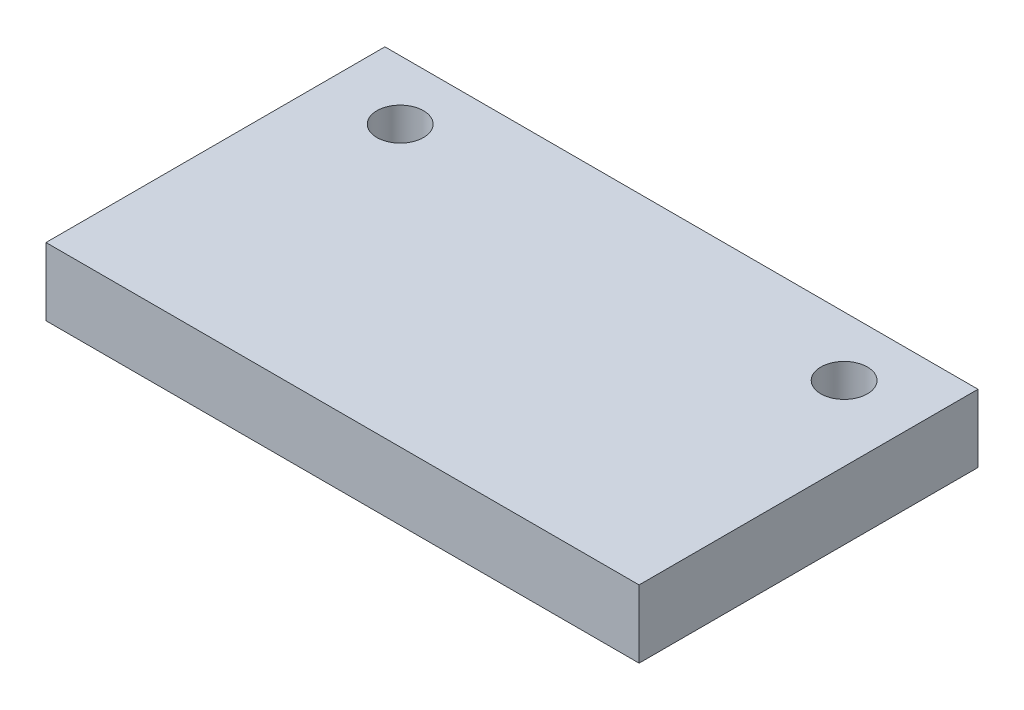
ISO-10303-21;
HEADER;
FILE_DESCRIPTION(('STEP AP214'),'2;1');
FILE_NAME('part.step','',(''),(''),'','','');
FILE_SCHEMA(('AUTOMOTIVE_DESIGN { 1 0 10303 214 1 1 1 1 }'));
ENDSEC;
DATA;
#1=APPLICATION_CONTEXT('core data for automotive mechanical design processes');
#2=APPLICATION_PROTOCOL_DEFINITION('international standard','automotive_design',2000,#1);
#3=PRODUCT_CONTEXT('',#1,'mechanical');
#4=PRODUCT('Part','Part','',(#3));
#5=PRODUCT_RELATED_PRODUCT_CATEGORY('part','',(#4));
#6=PRODUCT_DEFINITION_FORMATION('','',#4);
#7=PRODUCT_DEFINITION_CONTEXT('part definition',#1,'design');
#8=PRODUCT_DEFINITION('design','',#6,#7);
#9=PRODUCT_DEFINITION_SHAPE('','',#8);
#10=(LENGTH_UNIT() NAMED_UNIT(*) SI_UNIT(.MILLI.,.METRE.));
#11=(NAMED_UNIT(*) PLANE_ANGLE_UNIT() SI_UNIT($,.RADIAN.));
#12=(NAMED_UNIT(*) SI_UNIT($,.STERADIAN.) SOLID_ANGLE_UNIT());
#13=UNCERTAINTY_MEASURE_WITH_UNIT(LENGTH_MEASURE(1.E-05),#10,'distance_accuracy_value','');
#14=(GEOMETRIC_REPRESENTATION_CONTEXT(3) GLOBAL_UNCERTAINTY_ASSIGNED_CONTEXT((#13)) GLOBAL_UNIT_ASSIGNED_CONTEXT((#10,
#11,#12)) REPRESENTATION_CONTEXT('',''));
#15=CARTESIAN_POINT('',(0.,0.,0.));
#16=DIRECTION('',(0.,0.,1.));
#17=DIRECTION('',(1.,0.,0.));
#18=AXIS2_PLACEMENT_3D('',#15,#16,#17);
#19=CARTESIAN_POINT('',(0.,80.,0.));
#20=DIRECTION('',(0.,1.,0.));
#21=DIRECTION('',(0.,0.,1.));
#22=AXIS2_PLACEMENT_3D('',#19,#20,#21);
#23=PLANE('',#22);
#24=DIRECTION('',(0.,0.,1.));
#25=VECTOR('',#24,1.);
#26=CARTESIAN_POINT('',(-321.608040201005,80.,-142.462311557789));
#27=LINE('',#26,#25);
#28=CARTESIAN_POINT('',(-321.608040201005,80.,-142.462311557789));
#29=VERTEX_POINT('',#28);
#30=CARTESIAN_POINT('',(-321.608040201005,80.,257.537688442211));
#31=VERTEX_POINT('',#30);
#32=EDGE_CURVE('E87',#29,#31,#27,.T.);
#33=ORIENTED_EDGE('',*,*,#32,.T.);
#34=DIRECTION('',(1.,0.,0.));
#35=VECTOR('',#34,1.);
#36=CARTESIAN_POINT('',(-321.608040201005,80.,257.537688442211));
#37=LINE('',#36,#35);
#38=CARTESIAN_POINT('',(378.391959798995,80.,257.537688442211));
#39=VERTEX_POINT('',#38);
#40=EDGE_CURVE('E82',#31,#39,#37,.T.);
#41=ORIENTED_EDGE('',*,*,#40,.T.);
#42=DIRECTION('',(0.,0.,-1.));
#43=VECTOR('',#42,1.);
#44=CARTESIAN_POINT('',(378.391959798995,80.,-142.462311557789));
#45=LINE('',#44,#43);
#46=CARTESIAN_POINT('',(378.391959798995,80.,-142.462311557789));
#47=VERTEX_POINT('',#46);
#48=EDGE_CURVE('E85',#39,#47,#45,.T.);
#49=ORIENTED_EDGE('',*,*,#48,.T.);
#50=DIRECTION('',(-1.,0.,0.));
#51=VECTOR('',#50,1.);
#52=CARTESIAN_POINT('',(-321.608040201005,80.,-142.462311557789));
#53=LINE('',#52,#51);
#54=EDGE_CURVE('E52',#47,#29,#53,.T.);
#55=ORIENTED_EDGE('',*,*,#54,.T.);
#56=EDGE_LOOP('',(#33,#41,#49,#55));
#57=FACE_BOUND('',#56,.T.);
#58=CARTESIAN_POINT('',(-233.576451519509,80.,-72.4747749309411));
#59=DIRECTION('',(0.,1.,0.));
#60=DIRECTION('',(0.,0.,1.));
#61=AXIS2_PLACEMENT_3D('',#58,#59,#60);
#62=CIRCLE('',#61,27.5);
#63=CARTESIAN_POINT('',(-233.576451519509,80.,-44.9747749309411));
#64=VERTEX_POINT('',#63);
#65=EDGE_CURVE('E114',#64,#64,#62,.T.);
#66=ORIENTED_EDGE('',*,*,#65,.F.);
#67=EDGE_LOOP('',(#66));
#68=FACE_BOUND('',#67,.T.);
#69=CARTESIAN_POINT('',(290.3603711175,80.,-72.4747749309411));
#70=DIRECTION('',(0.,-1.,0.));
#71=DIRECTION('',(0.,0.,-1.));
#72=AXIS2_PLACEMENT_3D('',#69,#70,#71);
#73=CIRCLE('',#72,27.4999999999999);
#74=CARTESIAN_POINT('',(290.3603711175,80.,-99.9747749309411));
#75=VERTEX_POINT('',#74);
#76=EDGE_CURVE('E120',#75,#75,#73,.T.);
#77=ORIENTED_EDGE('',*,*,#76,.T.);
#78=EDGE_LOOP('',(#77));
#79=FACE_BOUND('',#78,.T.);
#80=ADVANCED_FACE('F35',(#57,#68,#79),#23,.T.);
#81=CARTESIAN_POINT('',(0.,0.,0.));
#82=DIRECTION('',(0.,1.,0.));
#83=DIRECTION('',(0.,0.,1.));
#84=AXIS2_PLACEMENT_3D('',#81,#82,#83);
#85=PLANE('',#84);
#86=DIRECTION('',(0.,0.,1.));
#87=VECTOR('',#86,1.);
#88=CARTESIAN_POINT('',(-321.608040201005,0.,-142.462311557789));
#89=LINE('',#88,#87);
#90=CARTESIAN_POINT('',(-321.608040201005,0.,-142.462311557789));
#91=VERTEX_POINT('',#90);
#92=CARTESIAN_POINT('',(-321.608040201005,0.,257.537688442211));
#93=VERTEX_POINT('',#92);
#94=EDGE_CURVE('E99',#91,#93,#89,.T.);
#95=ORIENTED_EDGE('',*,*,#94,.F.);
#96=DIRECTION('',(-1.,0.,0.));
#97=VECTOR('',#96,1.);
#98=CARTESIAN_POINT('',(-321.608040201005,0.,-142.462311557789));
#99=LINE('',#98,#97);
#100=CARTESIAN_POINT('',(378.391959798995,0.,-142.462311557789));
#101=VERTEX_POINT('',#100);
#102=EDGE_CURVE('E75',#101,#91,#99,.T.);
#103=ORIENTED_EDGE('',*,*,#102,.F.);
#104=DIRECTION('',(0.,0.,-1.));
#105=VECTOR('',#104,1.);
#106=CARTESIAN_POINT('',(378.391959798995,0.,-142.462311557789));
#107=LINE('',#106,#105);
#108=CARTESIAN_POINT('',(378.391959798995,0.,257.537688442211));
#109=VERTEX_POINT('',#108);
#110=EDGE_CURVE('E69',#109,#101,#107,.T.);
#111=ORIENTED_EDGE('',*,*,#110,.F.);
#112=DIRECTION('',(1.,0.,0.));
#113=VECTOR('',#112,1.);
#114=CARTESIAN_POINT('',(-321.608040201005,0.,257.537688442211));
#115=LINE('',#114,#113);
#116=EDGE_CURVE('E91',#93,#109,#115,.T.);
#117=ORIENTED_EDGE('',*,*,#116,.F.);
#118=EDGE_LOOP('',(#95,#103,#111,#117));
#119=FACE_BOUND('',#118,.T.);
#120=CARTESIAN_POINT('',(-233.576451519509,0.,-72.4747749309411));
#121=DIRECTION('',(0.,1.,0.));
#122=DIRECTION('',(0.,0.,1.));
#123=AXIS2_PLACEMENT_3D('',#120,#121,#122);
#124=CIRCLE('',#123,27.5);
#125=CARTESIAN_POINT('',(-233.576451519509,0.,-44.9747749309411));
#126=VERTEX_POINT('',#125);
#127=EDGE_CURVE('E102',#126,#126,#124,.T.);
#128=ORIENTED_EDGE('',*,*,#127,.T.);
#129=EDGE_LOOP('',(#128));
#130=FACE_BOUND('',#129,.T.);
#131=CARTESIAN_POINT('',(290.3603711175,0.,-72.4747749309411));
#132=DIRECTION('',(0.,-1.,0.));
#133=DIRECTION('',(0.,0.,-1.));
#134=AXIS2_PLACEMENT_3D('',#131,#132,#133);
#135=CIRCLE('',#134,27.4999999999999);
#136=CARTESIAN_POINT('',(290.3603711175,0.,-99.9747749309411));
#137=VERTEX_POINT('',#136);
#138=EDGE_CURVE('E117',#137,#137,#135,.T.);
#139=ORIENTED_EDGE('',*,*,#138,.F.);
#140=EDGE_LOOP('',(#139));
#141=FACE_BOUND('',#140,.T.);
#142=ADVANCED_FACE('F110',(#119,#130,#141),#85,.F.);
#143=CARTESIAN_POINT('',(-321.608040201005,80.,-142.462311557789));
#144=DIRECTION('',(1.,0.,0.));
#145=DIRECTION('',(0.,0.,-1.));
#146=AXIS2_PLACEMENT_3D('',#143,#144,#145);
#147=PLANE('',#146);
#148=ORIENTED_EDGE('',*,*,#94,.T.);
#149=DIRECTION('',(0.,-1.,0.));
#150=VECTOR('',#149,1.);
#151=CARTESIAN_POINT('',(-321.608040201005,80.,257.537688442211));
#152=LINE('',#151,#150);
#153=EDGE_CURVE('E11',#31,#93,#152,.T.);
#154=ORIENTED_EDGE('',*,*,#153,.F.);
#155=ORIENTED_EDGE('',*,*,#32,.F.);
#156=DIRECTION('',(0.,-1.,0.));
#157=VECTOR('',#156,1.);
#158=CARTESIAN_POINT('',(-321.608040201005,80.,-142.462311557789));
#159=LINE('',#158,#157);
#160=EDGE_CURVE('E95',#29,#91,#159,.T.);
#161=ORIENTED_EDGE('',*,*,#160,.T.);
#162=EDGE_LOOP('',(#148,#154,#155,#161));
#163=FACE_BOUND('',#162,.T.);
#164=ADVANCED_FACE('F37',(#163),#147,.F.);
#165=CARTESIAN_POINT('',(-321.608040201005,80.,257.537688442211));
#166=DIRECTION('',(0.,0.,-1.));
#167=DIRECTION('',(-1.,0.,0.));
#168=AXIS2_PLACEMENT_3D('',#165,#166,#167);
#169=PLANE('',#168);
#170=ORIENTED_EDGE('',*,*,#116,.T.);
#171=DIRECTION('',(0.,-1.,0.));
#172=VECTOR('',#171,1.);
#173=CARTESIAN_POINT('',(378.391959798995,80.,257.537688442211));
#174=LINE('',#173,#172);
#175=EDGE_CURVE('E44',#39,#109,#174,.T.);
#176=ORIENTED_EDGE('',*,*,#175,.F.);
#177=ORIENTED_EDGE('',*,*,#40,.F.);
#178=ORIENTED_EDGE('',*,*,#153,.T.);
#179=EDGE_LOOP('',(#170,#176,#177,#178));
#180=FACE_BOUND('',#179,.T.);
#181=ADVANCED_FACE('F90',(#180),#169,.F.);
#182=CARTESIAN_POINT('',(378.391959798995,80.,-142.462311557789));
#183=DIRECTION('',(-1.,0.,0.));
#184=DIRECTION('',(0.,0.,1.));
#185=AXIS2_PLACEMENT_3D('',#182,#183,#184);
#186=PLANE('',#185);
#187=ORIENTED_EDGE('',*,*,#110,.T.);
#188=DIRECTION('',(0.,-1.,0.));
#189=VECTOR('',#188,1.);
#190=CARTESIAN_POINT('',(378.391959798995,80.,-142.462311557789));
#191=LINE('',#190,#189);
#192=EDGE_CURVE('E92',#47,#101,#191,.T.);
#193=ORIENTED_EDGE('',*,*,#192,.F.);
#194=ORIENTED_EDGE('',*,*,#48,.F.);
#195=ORIENTED_EDGE('',*,*,#175,.T.);
#196=EDGE_LOOP('',(#187,#193,#194,#195));
#197=FACE_BOUND('',#196,.T.);
#198=ADVANCED_FACE('F93',(#197),#186,.F.);
#199=CARTESIAN_POINT('',(-321.608040201005,80.,-142.462311557789));
#200=DIRECTION('',(0.,0.,1.));
#201=DIRECTION('',(1.,0.,0.));
#202=AXIS2_PLACEMENT_3D('',#199,#200,#201);
#203=PLANE('',#202);
#204=ORIENTED_EDGE('',*,*,#102,.T.);
#205=ORIENTED_EDGE('',*,*,#160,.F.);
#206=ORIENTED_EDGE('',*,*,#54,.F.);
#207=ORIENTED_EDGE('',*,*,#192,.T.);
#208=EDGE_LOOP('',(#204,#205,#206,#207));
#209=FACE_BOUND('',#208,.T.);
#210=ADVANCED_FACE('F107',(#209),#203,.F.);
#211=CARTESIAN_POINT('',(-233.576451519509,0.,-72.4747749309411));
#212=DIRECTION('',(0.,1.,0.));
#213=DIRECTION('',(0.,0.,1.));
#214=AXIS2_PLACEMENT_3D('',#211,#212,#213);
#215=CYLINDRICAL_SURFACE('',#214,27.5);
#216=ORIENTED_EDGE('',*,*,#127,.F.);
#217=EDGE_LOOP('',(#216));
#218=FACE_BOUND('',#217,.T.);
#219=ORIENTED_EDGE('',*,*,#65,.T.);
#220=EDGE_LOOP('',(#219));
#221=FACE_BOUND('',#220,.T.);
#222=ADVANCED_FACE('F140',(#218,#221),#215,.F.);
#223=CARTESIAN_POINT('',(290.3603711175,0.,-72.4747749309411));
#224=DIRECTION('',(0.,1.,0.));
#225=DIRECTION('',(0.,0.,1.));
#226=AXIS2_PLACEMENT_3D('',#223,#224,#225);
#227=CYLINDRICAL_SURFACE('',#226,27.4999999999999);
#228=ORIENTED_EDGE('',*,*,#138,.T.);
#229=EDGE_LOOP('',(#228));
#230=FACE_BOUND('',#229,.T.);
#231=ORIENTED_EDGE('',*,*,#76,.F.);
#232=EDGE_LOOP('',(#231));
#233=FACE_BOUND('',#232,.T.);
#234=ADVANCED_FACE('F126',(#230,#233),#227,.F.);
#235=CLOSED_SHELL('',(#80,#142,#164,#181,#198,#210,#222,#234));
#236=MANIFOLD_SOLID_BREP('B2',#235);
#237=ADVANCED_BREP_SHAPE_REPRESENTATION('',(#18,#236),#14);
#238=SHAPE_DEFINITION_REPRESENTATION(#9,#237);
ENDSEC;
END-ISO-10303-21;
